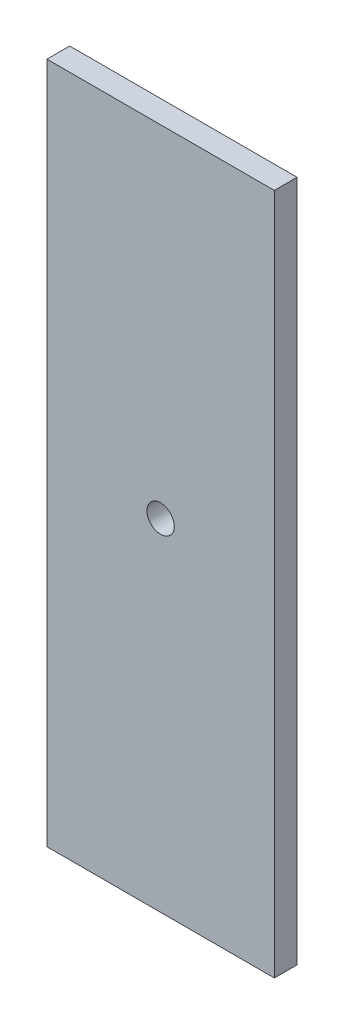
ISO-10303-21;
HEADER;
FILE_DESCRIPTION(('STEP AP214'),'2;1');
FILE_NAME('part.step','',(''),(''),'','','');
FILE_SCHEMA(('AUTOMOTIVE_DESIGN { 1 0 10303 214 1 1 1 1 }'));
ENDSEC;
DATA;
#1=APPLICATION_CONTEXT('core data for automotive mechanical design processes');
#2=APPLICATION_PROTOCOL_DEFINITION('international standard','automotive_design',2000,#1);
#3=PRODUCT_CONTEXT('',#1,'mechanical');
#4=PRODUCT('Part','Part','',(#3));
#5=PRODUCT_RELATED_PRODUCT_CATEGORY('part','',(#4));
#6=PRODUCT_DEFINITION_FORMATION('','',#4);
#7=PRODUCT_DEFINITION_CONTEXT('part definition',#1,'design');
#8=PRODUCT_DEFINITION('design','',#6,#7);
#9=PRODUCT_DEFINITION_SHAPE('','',#8);
#10=(LENGTH_UNIT() NAMED_UNIT(*) SI_UNIT(.MILLI.,.METRE.));
#11=(NAMED_UNIT(*) PLANE_ANGLE_UNIT() SI_UNIT($,.RADIAN.));
#12=(NAMED_UNIT(*) SI_UNIT($,.STERADIAN.) SOLID_ANGLE_UNIT());
#13=UNCERTAINTY_MEASURE_WITH_UNIT(LENGTH_MEASURE(1.E-05),#10,'distance_accuracy_value','');
#14=(GEOMETRIC_REPRESENTATION_CONTEXT(3) GLOBAL_UNCERTAINTY_ASSIGNED_CONTEXT((#13)) GLOBAL_UNIT_ASSIGNED_CONTEXT((#10,
#11,#12)) REPRESENTATION_CONTEXT('',''));
#15=CARTESIAN_POINT('',(0.,0.,0.));
#16=DIRECTION('',(0.,0.,1.));
#17=DIRECTION('',(1.,0.,0.));
#18=AXIS2_PLACEMENT_3D('',#15,#16,#17);
#19=CARTESIAN_POINT('',(25.,-75.,5.));
#20=DIRECTION('',(-1.,0.,0.));
#21=DIRECTION('',(0.,0.,1.));
#22=AXIS2_PLACEMENT_3D('',#19,#20,#21);
#23=PLANE('',#22);
#24=DIRECTION('',(0.,1.,0.));
#25=VECTOR('',#24,1.);
#26=CARTESIAN_POINT('',(25.,-75.,0.));
#27=LINE('',#26,#25);
#28=CARTESIAN_POINT('',(25.,-75.,0.));
#29=VERTEX_POINT('',#28);
#30=CARTESIAN_POINT('',(25.,75.,0.));
#31=VERTEX_POINT('',#30);
#32=EDGE_CURVE('E107',#29,#31,#27,.T.);
#33=ORIENTED_EDGE('',*,*,#32,.T.);
#34=DIRECTION('',(0.,0.,-1.));
#35=VECTOR('',#34,1.);
#36=CARTESIAN_POINT('',(25.,75.,5.));
#37=LINE('',#36,#35);
#38=CARTESIAN_POINT('',(25.,75.,5.));
#39=VERTEX_POINT('',#38);
#40=EDGE_CURVE('E11',#39,#31,#37,.T.);
#41=ORIENTED_EDGE('',*,*,#40,.F.);
#42=DIRECTION('',(0.,1.,0.));
#43=VECTOR('',#42,1.);
#44=CARTESIAN_POINT('',(25.,-75.,5.));
#45=LINE('',#44,#43);
#46=CARTESIAN_POINT('',(25.,-75.,5.));
#47=VERTEX_POINT('',#46);
#48=EDGE_CURVE('E91',#47,#39,#45,.T.);
#49=ORIENTED_EDGE('',*,*,#48,.F.);
#50=DIRECTION('',(0.,0.,-1.));
#51=VECTOR('',#50,1.);
#52=CARTESIAN_POINT('',(25.,-75.,5.));
#53=LINE('',#52,#51);
#54=EDGE_CURVE('E103',#47,#29,#53,.T.);
#55=ORIENTED_EDGE('',*,*,#54,.T.);
#56=EDGE_LOOP('',(#33,#41,#49,#55));
#57=FACE_BOUND('',#56,.T.);
#58=ADVANCED_FACE('F39',(#57),#23,.F.);
#59=CARTESIAN_POINT('',(-25.,75.,5.));
#60=DIRECTION('',(0.,-1.,0.));
#61=DIRECTION('',(0.,0.,-1.));
#62=AXIS2_PLACEMENT_3D('',#59,#60,#61);
#63=PLANE('',#62);
#64=DIRECTION('',(-1.,0.,0.));
#65=VECTOR('',#64,1.);
#66=CARTESIAN_POINT('',(-25.,75.,0.));
#67=LINE('',#66,#65);
#68=CARTESIAN_POINT('',(-25.,75.,0.));
#69=VERTEX_POINT('',#68);
#70=EDGE_CURVE('E96',#31,#69,#67,.T.);
#71=ORIENTED_EDGE('',*,*,#70,.T.);
#72=DIRECTION('',(0.,0.,-1.));
#73=VECTOR('',#72,1.);
#74=CARTESIAN_POINT('',(-25.,75.,5.));
#75=LINE('',#74,#73);
#76=CARTESIAN_POINT('',(-25.,75.,5.));
#77=VERTEX_POINT('',#76);
#78=EDGE_CURVE('E48',#77,#69,#75,.T.);
#79=ORIENTED_EDGE('',*,*,#78,.F.);
#80=DIRECTION('',(-1.,0.,0.));
#81=VECTOR('',#80,1.);
#82=CARTESIAN_POINT('',(-25.,75.,5.));
#83=LINE('',#82,#81);
#84=EDGE_CURVE('E86',#39,#77,#83,.T.);
#85=ORIENTED_EDGE('',*,*,#84,.F.);
#86=ORIENTED_EDGE('',*,*,#40,.T.);
#87=EDGE_LOOP('',(#71,#79,#85,#86));
#88=FACE_BOUND('',#87,.T.);
#89=ADVANCED_FACE('F95',(#88),#63,.F.);
#90=CARTESIAN_POINT('',(-25.,-75.,5.));
#91=DIRECTION('',(1.,0.,0.));
#92=DIRECTION('',(0.,0.,-1.));
#93=AXIS2_PLACEMENT_3D('',#90,#91,#92);
#94=PLANE('',#93);
#95=DIRECTION('',(0.,-1.,0.));
#96=VECTOR('',#95,1.);
#97=CARTESIAN_POINT('',(-25.,-75.,0.));
#98=LINE('',#97,#96);
#99=CARTESIAN_POINT('',(-25.,-75.,0.));
#100=VERTEX_POINT('',#99);
#101=EDGE_CURVE('E73',#69,#100,#98,.T.);
#102=ORIENTED_EDGE('',*,*,#101,.T.);
#103=DIRECTION('',(0.,0.,-1.));
#104=VECTOR('',#103,1.);
#105=CARTESIAN_POINT('',(-25.,-75.,5.));
#106=LINE('',#105,#104);
#107=CARTESIAN_POINT('',(-25.,-75.,5.));
#108=VERTEX_POINT('',#107);
#109=EDGE_CURVE('E98',#108,#100,#106,.T.);
#110=ORIENTED_EDGE('',*,*,#109,.F.);
#111=DIRECTION('',(0.,-1.,0.));
#112=VECTOR('',#111,1.);
#113=CARTESIAN_POINT('',(-25.,-75.,5.));
#114=LINE('',#113,#112);
#115=EDGE_CURVE('E89',#77,#108,#114,.T.);
#116=ORIENTED_EDGE('',*,*,#115,.F.);
#117=ORIENTED_EDGE('',*,*,#78,.T.);
#118=EDGE_LOOP('',(#102,#110,#116,#117));
#119=FACE_BOUND('',#118,.T.);
#120=ADVANCED_FACE('F99',(#119),#94,.F.);
#121=CARTESIAN_POINT('',(-25.,-75.,5.));
#122=DIRECTION('',(0.,1.,0.));
#123=DIRECTION('',(0.,0.,1.));
#124=AXIS2_PLACEMENT_3D('',#121,#122,#123);
#125=PLANE('',#124);
#126=DIRECTION('',(1.,0.,0.));
#127=VECTOR('',#126,1.);
#128=CARTESIAN_POINT('',(-25.,-75.,0.));
#129=LINE('',#128,#127);
#130=EDGE_CURVE('E79',#100,#29,#129,.T.);
#131=ORIENTED_EDGE('',*,*,#130,.T.);
#132=ORIENTED_EDGE('',*,*,#54,.F.);
#133=DIRECTION('',(1.,0.,0.));
#134=VECTOR('',#133,1.);
#135=CARTESIAN_POINT('',(-25.,-75.,5.));
#136=LINE('',#135,#134);
#137=EDGE_CURVE('E56',#108,#47,#136,.T.);
#138=ORIENTED_EDGE('',*,*,#137,.F.);
#139=ORIENTED_EDGE('',*,*,#109,.T.);
#140=EDGE_LOOP('',(#131,#132,#138,#139));
#141=FACE_BOUND('',#140,.T.);
#142=ADVANCED_FACE('F121',(#141),#125,.F.);
#143=CARTESIAN_POINT('',(0.,0.,5.));
#144=DIRECTION('',(0.,0.,-1.));
#145=DIRECTION('',(-1.,0.,0.));
#146=AXIS2_PLACEMENT_3D('',#143,#144,#145);
#147=PLANE('',#146);
#148=CARTESIAN_POINT('',(0.,0.,5.));
#149=DIRECTION('',(0.,0.,1.));
#150=DIRECTION('',(1.,0.,0.));
#151=AXIS2_PLACEMENT_3D('',#148,#149,#150);
#152=CIRCLE('',#151,3.);
#153=CARTESIAN_POINT('',(3.,0.,5.));
#154=VERTEX_POINT('',#153);
#155=EDGE_CURVE('E128',#154,#154,#152,.T.);
#156=ORIENTED_EDGE('',*,*,#155,.F.);
#157=EDGE_LOOP('',(#156));
#158=FACE_BOUND('',#157,.T.);
#159=ORIENTED_EDGE('',*,*,#48,.T.);
#160=ORIENTED_EDGE('',*,*,#84,.T.);
#161=ORIENTED_EDGE('',*,*,#115,.T.);
#162=ORIENTED_EDGE('',*,*,#137,.T.);
#163=EDGE_LOOP('',(#159,#160,#161,#162));
#164=FACE_BOUND('',#163,.T.);
#165=ADVANCED_FACE('F87',(#158,#164),#147,.F.);
#166=CARTESIAN_POINT('',(0.,0.,0.));
#167=DIRECTION('',(0.,0.,-1.));
#168=DIRECTION('',(-1.,0.,0.));
#169=AXIS2_PLACEMENT_3D('',#166,#167,#168);
#170=PLANE('',#169);
#171=CARTESIAN_POINT('',(0.,0.,0.));
#172=DIRECTION('',(0.,0.,1.));
#173=DIRECTION('',(1.,0.,0.));
#174=AXIS2_PLACEMENT_3D('',#171,#172,#173);
#175=CIRCLE('',#174,3.);
#176=CARTESIAN_POINT('',(3.,0.,0.));
#177=VERTEX_POINT('',#176);
#178=EDGE_CURVE('E111',#177,#177,#175,.T.);
#179=ORIENTED_EDGE('',*,*,#178,.T.);
#180=EDGE_LOOP('',(#179));
#181=FACE_BOUND('',#180,.T.);
#182=ORIENTED_EDGE('',*,*,#32,.F.);
#183=ORIENTED_EDGE('',*,*,#130,.F.);
#184=ORIENTED_EDGE('',*,*,#101,.F.);
#185=ORIENTED_EDGE('',*,*,#70,.F.);
#186=EDGE_LOOP('',(#182,#183,#184,#185));
#187=FACE_BOUND('',#186,.T.);
#188=ADVANCED_FACE('F124',(#181,#187),#170,.T.);
#189=CARTESIAN_POINT('',(0.,0.,0.));
#190=DIRECTION('',(0.,0.,1.));
#191=DIRECTION('',(1.,0.,0.));
#192=AXIS2_PLACEMENT_3D('',#189,#190,#191);
#193=CYLINDRICAL_SURFACE('',#192,3.);
#194=ORIENTED_EDGE('',*,*,#178,.F.);
#195=EDGE_LOOP('',(#194));
#196=FACE_BOUND('',#195,.T.);
#197=ORIENTED_EDGE('',*,*,#155,.T.);
#198=EDGE_LOOP('',(#197));
#199=FACE_BOUND('',#198,.T.);
#200=ADVANCED_FACE('F137',(#196,#199),#193,.F.);
#201=CLOSED_SHELL('',(#58,#89,#120,#142,#165,#188,#200));
#202=MANIFOLD_SOLID_BREP('B2',#201);
#203=ADVANCED_BREP_SHAPE_REPRESENTATION('',(#18,#202),#14);
#204=SHAPE_DEFINITION_REPRESENTATION(#9,#203);
ENDSEC;
END-ISO-10303-21;
